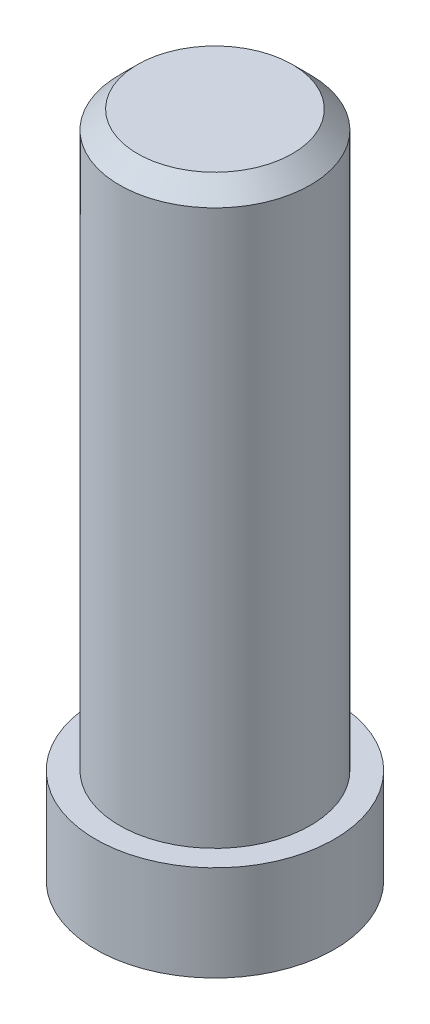
ISO-10303-21;
HEADER;
FILE_DESCRIPTION(('STEP AP214'),'2;1');
FILE_NAME('part.step','',(''),(''),'','','');
FILE_SCHEMA(('AUTOMOTIVE_DESIGN { 1 0 10303 214 1 1 1 1 }'));
ENDSEC;
DATA;
#1=APPLICATION_CONTEXT('core data for automotive mechanical design processes');
#2=APPLICATION_PROTOCOL_DEFINITION('international standard','automotive_design',2000,#1);
#3=PRODUCT_CONTEXT('',#1,'mechanical');
#4=PRODUCT('Part','Part','',(#3));
#5=PRODUCT_RELATED_PRODUCT_CATEGORY('part','',(#4));
#6=PRODUCT_DEFINITION_FORMATION('','',#4);
#7=PRODUCT_DEFINITION_CONTEXT('part definition',#1,'design');
#8=PRODUCT_DEFINITION('design','',#6,#7);
#9=PRODUCT_DEFINITION_SHAPE('','',#8);
#10=(LENGTH_UNIT() NAMED_UNIT(*) SI_UNIT(.MILLI.,.METRE.));
#11=(NAMED_UNIT(*) PLANE_ANGLE_UNIT() SI_UNIT($,.RADIAN.));
#12=(NAMED_UNIT(*) SI_UNIT($,.STERADIAN.) SOLID_ANGLE_UNIT());
#13=UNCERTAINTY_MEASURE_WITH_UNIT(LENGTH_MEASURE(1.E-05),#10,'distance_accuracy_value','');
#14=(GEOMETRIC_REPRESENTATION_CONTEXT(3) GLOBAL_UNCERTAINTY_ASSIGNED_CONTEXT((#13)) GLOBAL_UNIT_ASSIGNED_CONTEXT((#10,
#11,#12)) REPRESENTATION_CONTEXT('',''));
#15=CARTESIAN_POINT('',(0.,0.,0.));
#16=DIRECTION('',(0.,0.,1.));
#17=DIRECTION('',(1.,0.,0.));
#18=AXIS2_PLACEMENT_3D('',#15,#16,#17);
#19=CARTESIAN_POINT('',(0.,6.5,0.));
#20=DIRECTION('',(0.,-1.,0.));
#21=DIRECTION('',(0.,0.,-1.));
#22=AXIS2_PLACEMENT_3D('',#19,#20,#21);
#23=CYLINDRICAL_SURFACE('',#22,2.);
#24=CARTESIAN_POINT('',(0.,6.12100000000001,0.));
#25=DIRECTION('',(0.,-1.,0.));
#26=DIRECTION('',(0.,0.,-1.));
#27=AXIS2_PLACEMENT_3D('',#24,#25,#26);
#28=CIRCLE('',#27,2.);
#29=CARTESIAN_POINT('',(0.,6.12100000000001,-2.));
#30=VERTEX_POINT('',#29);
#31=EDGE_CURVE('E71',#30,#30,#28,.T.);
#32=CARTESIAN_POINT('',(0.,-5.5,0.));
#33=DIRECTION('',(0.,-1.,0.));
#34=DIRECTION('',(0.,0.,-1.));
#35=AXIS2_PLACEMENT_3D('',#32,#33,#34);
#36=CIRCLE('',#35,2.);
#37=CARTESIAN_POINT('',(0.,-5.5,-2.));
#38=VERTEX_POINT('',#37);
#39=EDGE_CURVE('E10',#38,#38,#36,.T.);
#40=CARTESIAN_POINT('',(0.,6.12100000000001,-2.));
#41=CARTESIAN_POINT('',(0.,5.99994791666668,-2.));
#42=CARTESIAN_POINT('',(0.,5.87889583333334,-2.));
#43=CARTESIAN_POINT('',(0.,5.63679166666668,-2.));
#44=CARTESIAN_POINT('',(0.,5.51573958333334,-2.));
#45=CARTESIAN_POINT('',(0.,5.27363541666668,-2.));
#46=CARTESIAN_POINT('',(0.,5.15258333333334,-2.));
#47=CARTESIAN_POINT('',(0.,4.91047916666668,-2.));
#48=CARTESIAN_POINT('',(0.,4.78942708333334,-2.));
#49=CARTESIAN_POINT('',(0.,4.54732291666668,-2.));
#50=CARTESIAN_POINT('',(0.,4.42627083333334,-2.));
#51=CARTESIAN_POINT('',(0.,4.18416666666668,-2.));
#52=CARTESIAN_POINT('',(0.,4.06311458333334,-2.));
#53=CARTESIAN_POINT('',(0.,3.82101041666667,-2.));
#54=CARTESIAN_POINT('',(0.,3.69995833333334,-2.));
#55=CARTESIAN_POINT('',(0.,3.45785416666667,-2.));
#56=CARTESIAN_POINT('',(0.,3.33680208333334,-2.));
#57=CARTESIAN_POINT('',(0.,3.09469791666667,-2.));
#58=CARTESIAN_POINT('',(0.,2.97364583333334,-2.));
#59=CARTESIAN_POINT('',(0.,2.73154166666667,-2.));
#60=CARTESIAN_POINT('',(0.,2.61048958333334,-2.));
#61=CARTESIAN_POINT('',(0.,2.36838541666667,-2.));
#62=CARTESIAN_POINT('',(0.,2.24733333333334,-2.));
#63=CARTESIAN_POINT('',(0.,2.00522916666667,-2.));
#64=CARTESIAN_POINT('',(0.,1.88417708333334,-2.));
#65=CARTESIAN_POINT('',(0.,1.64207291666667,-2.));
#66=CARTESIAN_POINT('',(0.,1.52102083333334,-2.));
#67=CARTESIAN_POINT('',(0.,1.27891666666667,-2.));
#68=CARTESIAN_POINT('',(0.,1.15786458333334,-2.));
#69=CARTESIAN_POINT('',(0.,0.915760416666672,-2.));
#70=CARTESIAN_POINT('',(0.,0.794708333333339,-2.));
#71=CARTESIAN_POINT('',(0.,0.552604166666672,-2.));
#72=CARTESIAN_POINT('',(0.,0.431552083333339,-2.));
#73=CARTESIAN_POINT('',(0.,0.189447916666672,-2.));
#74=CARTESIAN_POINT('',(0.,0.0683958333333382,-2.));
#75=CARTESIAN_POINT('',(0.,-0.173708333333329,-2.));
#76=CARTESIAN_POINT('',(0.,-0.294760416666662,-2.));
#77=CARTESIAN_POINT('',(0.,-0.536864583333329,-2.));
#78=CARTESIAN_POINT('',(0.,-0.657916666666662,-2.));
#79=CARTESIAN_POINT('',(0.,-0.900020833333329,-2.));
#80=CARTESIAN_POINT('',(0.,-1.02107291666666,-2.));
#81=CARTESIAN_POINT('',(0.,-1.26317708333333,-2.));
#82=CARTESIAN_POINT('',(0.,-1.38422916666666,-2.));
#83=CARTESIAN_POINT('',(0.,-1.62633333333333,-2.));
#84=CARTESIAN_POINT('',(0.,-1.74738541666666,-2.));
#85=CARTESIAN_POINT('',(0.,-1.98948958333333,-2.));
#86=CARTESIAN_POINT('',(0.,-2.11054166666666,-2.));
#87=CARTESIAN_POINT('',(0.,-2.35264583333333,-2.));
#88=CARTESIAN_POINT('',(0.,-2.47369791666666,-2.));
#89=CARTESIAN_POINT('',(0.,-2.71580208333333,-2.));
#90=CARTESIAN_POINT('',(0.,-2.83685416666666,-2.));
#91=CARTESIAN_POINT('',(0.,-3.07895833333333,-2.));
#92=CARTESIAN_POINT('',(0.,-3.20001041666666,-2.));
#93=CARTESIAN_POINT('',(0.,-3.44211458333333,-2.));
#94=CARTESIAN_POINT('',(0.,-3.56316666666666,-2.));
#95=CARTESIAN_POINT('',(0.,-3.80527083333333,-2.));
#96=CARTESIAN_POINT('',(0.,-3.92632291666666,-2.));
#97=CARTESIAN_POINT('',(0.,-4.16842708333333,-2.));
#98=CARTESIAN_POINT('',(0.,-4.28947916666666,-2.));
#99=CARTESIAN_POINT('',(0.,-4.53158333333333,-2.));
#100=CARTESIAN_POINT('',(0.,-4.65263541666666,-2.));
#101=CARTESIAN_POINT('',(0.,-4.89473958333333,-2.));
#102=CARTESIAN_POINT('',(0.,-5.01579166666667,-2.));
#103=CARTESIAN_POINT('',(0.,-5.25789583333333,-2.));
#104=CARTESIAN_POINT('',(0.,-5.37894791666667,-2.));
#105=CARTESIAN_POINT('',(0.,-5.5,-2.));
#106=B_SPLINE_CURVE_WITH_KNOTS('',3,(#40,#41,#42,#43,#44,#45,#46,#47,#48,#49,#50,#51,#52,#53,
#54,#55,#56,#57,#58,#59,#60,#61,#62,#63,#64,#65,#66,#67,#68,#69,#70,#71,#72,#73,#74,#75,#76,#77,
#78,#79,#80,#81,#82,#83,#84,#85,#86,#87,#88,#89,#90,#91,#92,#93,#94,#95,#96,#97,#98,#99,#100,
#101,#102,#103,#104,#105),.UNSPECIFIED.,.F.,.F.,(4,2,2,2,2,2,2,2,2,2,2,2,2,2,2,2,2,2,2,2,2,2,2,
2,2,2,2,2,2,2,2,2,4),(0.,0.36315625,0.7263125,1.08946875,1.452625,1.81578125,2.1789375,
2.54209375,2.90525,3.26840625,3.6315625,3.99471875,4.357875,4.72103125,5.0841875,5.44734375,
5.8105,6.17365625,6.5368125,6.89996875,7.263125,7.62628125,7.98943750000001,8.35259375000001,
8.71575000000001,9.07890625000001,9.44206250000001,9.80521875000001,10.168375,10.53153125,
10.8946875,11.25784375,11.621),.UNSPECIFIED.);
#107=EDGE_CURVE('BSEAM53',#30,#38,#106,.T.);
#108=ORIENTED_EDGE('',*,*,#31,.T.);
#109=ORIENTED_EDGE('',*,*,#39,.F.);
#110=ORIENTED_EDGE('',*,*,#107,.T.);
#111=ORIENTED_EDGE('',*,*,#107,.F.);
#112=EDGE_LOOP('',(#108,#110,#109,#111));
#113=FACE_BOUND('',#112,.T.);
#114=ADVANCED_FACE('F53',(#113),#23,.T.);
#115=CARTESIAN_POINT('',(0.,-7.5,0.));
#116=DIRECTION('',(0.,1.,0.));
#117=DIRECTION('',(0.,0.,1.));
#118=AXIS2_PLACEMENT_3D('',#115,#116,#117);
#119=CYLINDRICAL_SURFACE('',#118,2.5);
#120=CARTESIAN_POINT('',(0.,-7.5,0.));
#121=DIRECTION('',(0.,-1.,0.));
#122=DIRECTION('',(0.,0.,-1.));
#123=AXIS2_PLACEMENT_3D('',#120,#121,#122);
#124=CIRCLE('',#123,2.5);
#125=CARTESIAN_POINT('',(0.,-7.5,-2.5));
#126=VERTEX_POINT('',#125);
#127=EDGE_CURVE('E60',#126,#126,#124,.T.);
#128=ORIENTED_EDGE('',*,*,#127,.F.);
#129=EDGE_LOOP('',(#128));
#130=FACE_BOUND('',#129,.T.);
#131=CARTESIAN_POINT('',(0.,-5.5,0.));
#132=DIRECTION('',(0.,-1.,0.));
#133=DIRECTION('',(0.,0.,-1.));
#134=AXIS2_PLACEMENT_3D('',#131,#132,#133);
#135=CIRCLE('',#134,2.5);
#136=CARTESIAN_POINT('',(0.,-5.5,-2.5));
#137=VERTEX_POINT('',#136);
#138=EDGE_CURVE('E65',#137,#137,#135,.T.);
#139=ORIENTED_EDGE('',*,*,#138,.T.);
#140=EDGE_LOOP('',(#139));
#141=FACE_BOUND('',#140,.T.);
#142=ADVANCED_FACE('F94',(#130,#141),#119,.T.);
#143=CARTESIAN_POINT('',(0.,-7.5,0.));
#144=DIRECTION('',(0.,-1.,0.));
#145=DIRECTION('',(0.,0.,-1.));
#146=AXIS2_PLACEMENT_3D('',#143,#144,#145);
#147=PLANE('',#146);
#148=ORIENTED_EDGE('',*,*,#127,.T.);
#149=EDGE_LOOP('',(#148));
#150=FACE_BOUND('',#149,.T.);
#151=ADVANCED_FACE('F99',(#150),#147,.T.);
#152=CARTESIAN_POINT('',(0.,-5.5,0.));
#153=DIRECTION('',(0.,-1.,0.));
#154=DIRECTION('',(0.,0.,-1.));
#155=AXIS2_PLACEMENT_3D('',#152,#153,#154);
#156=PLANE('',#155);
#157=ORIENTED_EDGE('',*,*,#39,.T.);
#158=EDGE_LOOP('',(#157));
#159=FACE_BOUND('',#158,.T.);
#160=ORIENTED_EDGE('',*,*,#138,.F.);
#161=EDGE_LOOP('',(#160));
#162=FACE_BOUND('',#161,.T.);
#163=ADVANCED_FACE('F89',(#159,#162),#156,.F.);
#164=CARTESIAN_POINT('',(0.,6.5,0.));
#165=DIRECTION('',(0.,-1.,0.));
#166=DIRECTION('',(0.,0.,-1.));
#167=AXIS2_PLACEMENT_3D('',#164,#165,#166);
#168=CONICAL_SURFACE('',#167,1.621,0.785398163397463);
#169=ORIENTED_EDGE('',*,*,#31,.F.);
#170=EDGE_LOOP('',(#169));
#171=FACE_BOUND('',#170,.T.);
#172=CARTESIAN_POINT('',(0.,6.5,0.));
#173=DIRECTION('',(0.,-1.,0.));
#174=DIRECTION('',(0.,0.,-1.));
#175=AXIS2_PLACEMENT_3D('',#172,#173,#174);
#176=CIRCLE('',#175,1.621);
#177=CARTESIAN_POINT('',(0.,6.5,-1.621));
#178=VERTEX_POINT('',#177);
#179=EDGE_CURVE('E76',#178,#178,#176,.T.);
#180=ORIENTED_EDGE('',*,*,#179,.T.);
#181=EDGE_LOOP('',(#180));
#182=FACE_BOUND('',#181,.T.);
#183=ADVANCED_FACE('F81',(#171,#182),#168,.T.);
#184=CARTESIAN_POINT('',(0.,6.5,0.));
#185=DIRECTION('',(0.,1.,0.));
#186=DIRECTION('',(0.,0.,1.));
#187=AXIS2_PLACEMENT_3D('',#184,#185,#186);
#188=PLANE('',#187);
#189=ORIENTED_EDGE('',*,*,#179,.F.);
#190=EDGE_LOOP('',(#189));
#191=FACE_BOUND('',#190,.T.);
#192=ADVANCED_FACE('F83',(#191),#188,.T.);
#193=CLOSED_SHELL('',(#114,#142,#151,#163,#183,#192));
#194=MANIFOLD_SOLID_BREP('B2',#193);
#195=ADVANCED_BREP_SHAPE_REPRESENTATION('',(#18,#194),#14);
#196=SHAPE_DEFINITION_REPRESENTATION(#9,#195);
ENDSEC;
END-ISO-10303-21;
